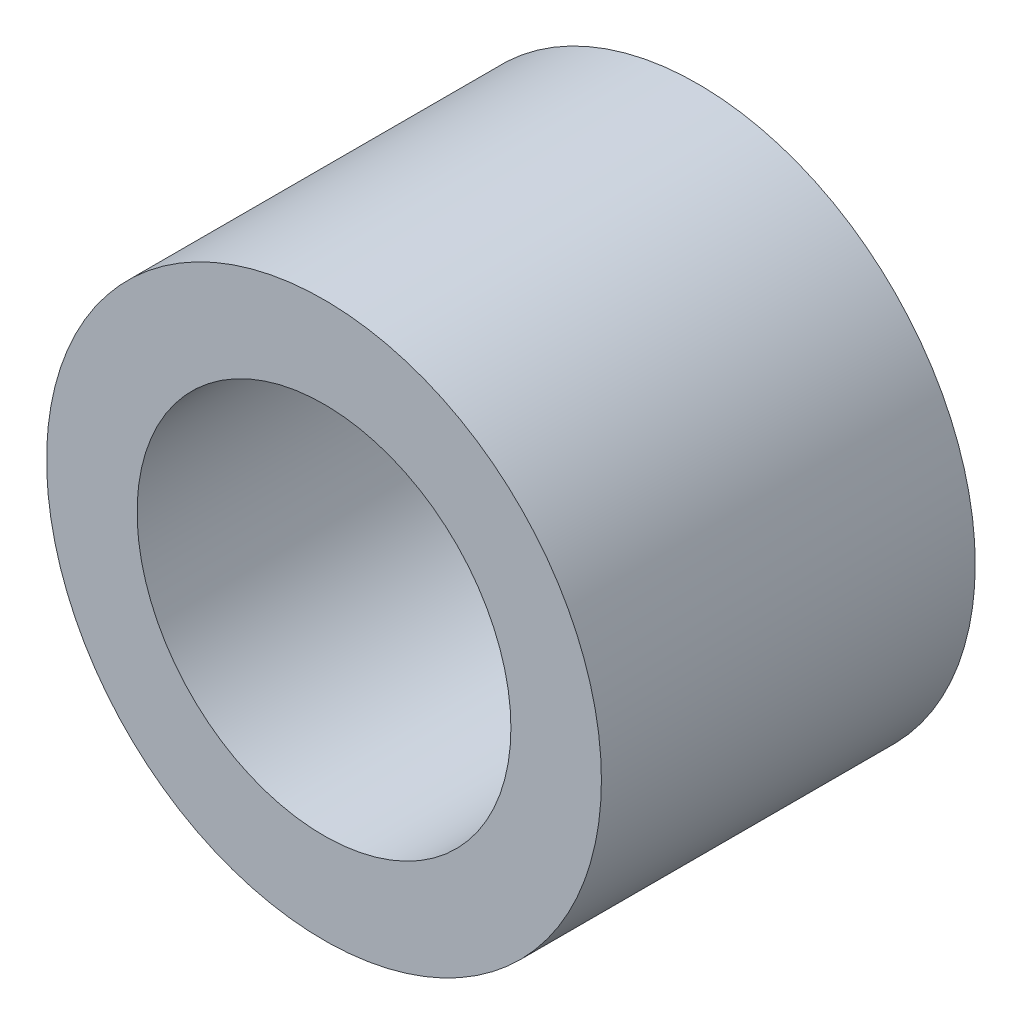
ISO-10303-21;
HEADER;
FILE_DESCRIPTION(('STEP AP214'),'2;1');
FILE_NAME('part.step','',(''),(''),'','','');
FILE_SCHEMA(('AUTOMOTIVE_DESIGN { 1 0 10303 214 1 1 1 1 }'));
ENDSEC;
DATA;
#1=APPLICATION_CONTEXT('core data for automotive mechanical design processes');
#2=APPLICATION_PROTOCOL_DEFINITION('international standard','automotive_design',2000,#1);
#3=PRODUCT_CONTEXT('',#1,'mechanical');
#4=PRODUCT('Part','Part','',(#3));
#5=PRODUCT_RELATED_PRODUCT_CATEGORY('part','',(#4));
#6=PRODUCT_DEFINITION_FORMATION('','',#4);
#7=PRODUCT_DEFINITION_CONTEXT('part definition',#1,'design');
#8=PRODUCT_DEFINITION('design','',#6,#7);
#9=PRODUCT_DEFINITION_SHAPE('','',#8);
#10=(LENGTH_UNIT() NAMED_UNIT(*) SI_UNIT(.MILLI.,.METRE.));
#11=(NAMED_UNIT(*) PLANE_ANGLE_UNIT() SI_UNIT($,.RADIAN.));
#12=(NAMED_UNIT(*) SI_UNIT($,.STERADIAN.) SOLID_ANGLE_UNIT());
#13=UNCERTAINTY_MEASURE_WITH_UNIT(LENGTH_MEASURE(1.E-05),#10,'distance_accuracy_value','');
#14=(GEOMETRIC_REPRESENTATION_CONTEXT(3) GLOBAL_UNCERTAINTY_ASSIGNED_CONTEXT((#13)) GLOBAL_UNIT_ASSIGNED_CONTEXT((#10,
#11,#12)) REPRESENTATION_CONTEXT('',''));
#15=CARTESIAN_POINT('',(0.,0.,0.));
#16=DIRECTION('',(0.,0.,1.));
#17=DIRECTION('',(1.,0.,0.));
#18=AXIS2_PLACEMENT_3D('',#15,#16,#17);
#19=CARTESIAN_POINT('',(0.,0.,-12.7));
#20=DIRECTION('',(0.,0.,1.));
#21=DIRECTION('',(1.,0.,0.));
#22=AXIS2_PLACEMENT_3D('',#19,#20,#21);
#23=CYLINDRICAL_SURFACE('',#22,9.4245140511312);
#24=CARTESIAN_POINT('',(0.,0.,-12.7));
#25=DIRECTION('',(0.,0.,1.));
#26=DIRECTION('',(1.,0.,0.));
#27=AXIS2_PLACEMENT_3D('',#24,#25,#26);
#28=CIRCLE('',#27,9.4245140511312);
#29=CARTESIAN_POINT('',(9.4245140511312,0.,-12.7));
#30=VERTEX_POINT('',#29);
#31=EDGE_CURVE('E10',#30,#30,#28,.T.);
#32=ORIENTED_EDGE('',*,*,#31,.T.);
#33=EDGE_LOOP('',(#32));
#34=FACE_BOUND('',#33,.T.);
#35=CARTESIAN_POINT('',(0.,0.,0.));
#36=DIRECTION('',(0.,0.,1.));
#37=DIRECTION('',(1.,0.,0.));
#38=AXIS2_PLACEMENT_3D('',#35,#36,#37);
#39=CIRCLE('',#38,9.4245140511312);
#40=CARTESIAN_POINT('',(9.4245140511312,0.,0.));
#41=VERTEX_POINT('',#40);
#42=EDGE_CURVE('E34',#41,#41,#39,.T.);
#43=ORIENTED_EDGE('',*,*,#42,.F.);
#44=EDGE_LOOP('',(#43));
#45=FACE_BOUND('',#44,.T.);
#46=ADVANCED_FACE('F31',(#34,#45),#23,.T.);
#47=CARTESIAN_POINT('',(0.,0.,-12.7));
#48=DIRECTION('',(0.,0.,1.));
#49=DIRECTION('',(1.,0.,0.));
#50=AXIS2_PLACEMENT_3D('',#47,#48,#49);
#51=PLANE('',#50);
#52=CARTESIAN_POINT('',(0.,0.,-12.7));
#53=DIRECTION('',(0.,0.,1.));
#54=DIRECTION('',(1.,0.,0.));
#55=AXIS2_PLACEMENT_3D('',#52,#53,#54);
#56=CIRCLE('',#55,6.35);
#57=CARTESIAN_POINT('',(6.35,0.,-12.7));
#58=VERTEX_POINT('',#57);
#59=EDGE_CURVE('E41',#58,#58,#56,.T.);
#60=ORIENTED_EDGE('',*,*,#59,.T.);
#61=EDGE_LOOP('',(#60));
#62=FACE_BOUND('',#61,.T.);
#63=ORIENTED_EDGE('',*,*,#31,.F.);
#64=EDGE_LOOP('',(#63));
#65=FACE_BOUND('',#64,.T.);
#66=ADVANCED_FACE('F49',(#62,#65),#51,.F.);
#67=CARTESIAN_POINT('',(0.,0.,0.));
#68=DIRECTION('',(0.,0.,1.));
#69=DIRECTION('',(1.,0.,0.));
#70=AXIS2_PLACEMENT_3D('',#67,#68,#69);
#71=PLANE('',#70);
#72=CARTESIAN_POINT('',(0.,0.,0.));
#73=DIRECTION('',(0.,0.,1.));
#74=DIRECTION('',(1.,0.,0.));
#75=AXIS2_PLACEMENT_3D('',#72,#73,#74);
#76=CIRCLE('',#75,6.35);
#77=CARTESIAN_POINT('',(6.35,0.,0.));
#78=VERTEX_POINT('',#77);
#79=EDGE_CURVE('E43',#78,#78,#76,.T.);
#80=ORIENTED_EDGE('',*,*,#79,.F.);
#81=EDGE_LOOP('',(#80));
#82=FACE_BOUND('',#81,.T.);
#83=ORIENTED_EDGE('',*,*,#42,.T.);
#84=EDGE_LOOP('',(#83));
#85=FACE_BOUND('',#84,.T.);
#86=ADVANCED_FACE('F55',(#82,#85),#71,.T.);
#87=CARTESIAN_POINT('',(0.,0.,-12.7));
#88=DIRECTION('',(0.,0.,1.));
#89=DIRECTION('',(1.,0.,0.));
#90=AXIS2_PLACEMENT_3D('',#87,#88,#89);
#91=CYLINDRICAL_SURFACE('',#90,6.35);
#92=ORIENTED_EDGE('',*,*,#59,.F.);
#93=EDGE_LOOP('',(#92));
#94=FACE_BOUND('',#93,.T.);
#95=ORIENTED_EDGE('',*,*,#79,.T.);
#96=EDGE_LOOP('',(#95));
#97=FACE_BOUND('',#96,.T.);
#98=ADVANCED_FACE('F52',(#94,#97),#91,.F.);
#99=CLOSED_SHELL('',(#46,#66,#86,#98));
#100=MANIFOLD_SOLID_BREP('B2',#99);
#101=ADVANCED_BREP_SHAPE_REPRESENTATION('',(#18,#100),#14);
#102=SHAPE_DEFINITION_REPRESENTATION(#9,#101);
ENDSEC;
END-ISO-10303-21;
